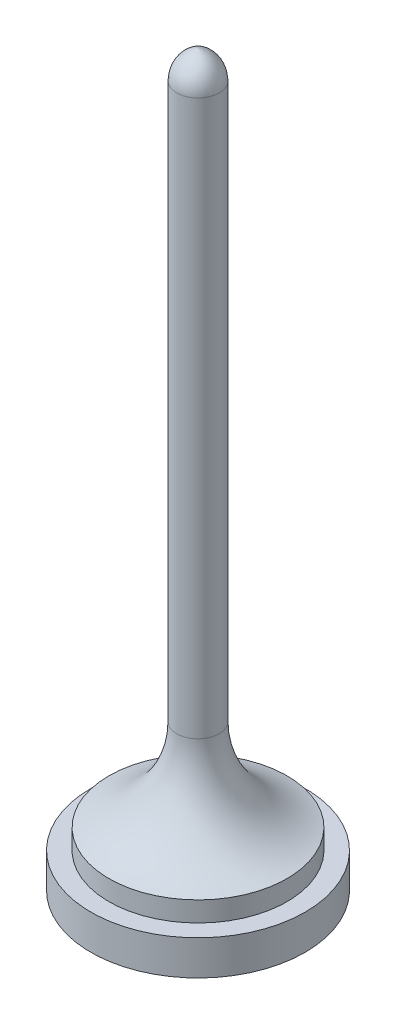
ISO-10303-21;
HEADER;
FILE_DESCRIPTION(('STEP AP214'),'2;1');
FILE_NAME('part.step','',(''),(''),'','','');
FILE_SCHEMA(('AUTOMOTIVE_DESIGN { 1 0 10303 214 1 1 1 1 }'));
ENDSEC;
DATA;
#1=APPLICATION_CONTEXT('core data for automotive mechanical design processes');
#2=APPLICATION_PROTOCOL_DEFINITION('international standard','automotive_design',2000,#1);
#3=PRODUCT_CONTEXT('',#1,'mechanical');
#4=PRODUCT('Part','Part','',(#3));
#5=PRODUCT_RELATED_PRODUCT_CATEGORY('part','',(#4));
#6=PRODUCT_DEFINITION_FORMATION('','',#4);
#7=PRODUCT_DEFINITION_CONTEXT('part definition',#1,'design');
#8=PRODUCT_DEFINITION('design','',#6,#7);
#9=PRODUCT_DEFINITION_SHAPE('','',#8);
#10=(LENGTH_UNIT() NAMED_UNIT(*) SI_UNIT(.MILLI.,.METRE.));
#11=(NAMED_UNIT(*) PLANE_ANGLE_UNIT() SI_UNIT($,.RADIAN.));
#12=(NAMED_UNIT(*) SI_UNIT($,.STERADIAN.) SOLID_ANGLE_UNIT());
#13=UNCERTAINTY_MEASURE_WITH_UNIT(LENGTH_MEASURE(1.E-05),#10,'distance_accuracy_value','');
#14=(GEOMETRIC_REPRESENTATION_CONTEXT(3) GLOBAL_UNCERTAINTY_ASSIGNED_CONTEXT((#13)) GLOBAL_UNIT_ASSIGNED_CONTEXT((#10,
#11,#12)) REPRESENTATION_CONTEXT('',''));
#15=CARTESIAN_POINT('',(0.,0.,0.));
#16=DIRECTION('',(0.,0.,1.));
#17=DIRECTION('',(1.,0.,0.));
#18=AXIS2_PLACEMENT_3D('',#15,#16,#17);
#19=CARTESIAN_POINT('',(1.22433534610712,108.6600566566,0.));
#20=DIRECTION('',(0.,0.,-1.));
#21=DIRECTION('',(-1.,0.,0.));
#22=AXIS2_PLACEMENT_3D('',#19,#20,#21);
#23=CIRCLE('',#22,4.50933534610712);
#24=TRIMMED_CURVE('',#23,(PARAMETER_VALUE(-1.29583339079884)),
(PARAMETER_VALUE(1.29583339079884)),.T.,.PARAMETER.);
#25=CARTESIAN_POINT('',(0.,108.6600566566,0.));
#26=DIRECTION('',(0.,1.,0.));
#27=AXIS1_PLACEMENT('',#25,#26);
#28=SURFACE_OF_REVOLUTION('',#24,#27);
#29=CARTESIAN_POINT('',(0.,108.6600566566,0.));
#30=DIRECTION('',(0.,1.,0.));
#31=DIRECTION('',(-1.,0.,0.));
#32=AXIS2_PLACEMENT_3D('',#29,#30,#31);
#33=CIRCLE('',#32,3.285);
#34=CARTESIAN_POINT('',(-3.285,108.6600566566,0.));
#35=VERTEX_POINT('',#34);
#36=EDGE_CURVE('E11',#35,#35,#33,.T.);
#37=ORIENTED_EDGE('',*,*,#36,.T.);
#38=EDGE_LOOP('',(#37));
#39=FACE_BOUND('',#38,.T.);
#40=CARTESIAN_POINT('',(0.,113.,0.));
#41=VERTEX_POINT('',#40);
#42=VERTEX_LOOP('',#41);
#43=FACE_BOUND('',#42,.T.);
#44=ADVANCED_FACE('F32',(#39,#43),#28,.T.);
#45=CARTESIAN_POINT('',(0.,113.,0.));
#46=DIRECTION('',(0.,1.,0.));
#47=DIRECTION('',(-1.,0.,0.));
#48=AXIS2_PLACEMENT_3D('',#45,#46,#47);
#49=CYLINDRICAL_SURFACE('',#48,3.285);
#50=CARTESIAN_POINT('',(0.,22.6764279519511,0.));
#51=DIRECTION('',(0.,1.,0.));
#52=DIRECTION('',(-1.,0.,0.));
#53=AXIS2_PLACEMENT_3D('',#50,#51,#52);
#54=CIRCLE('',#53,3.285);
#55=CARTESIAN_POINT('',(-3.285,22.6764279519511,0.));
#56=VERTEX_POINT('',#55);
#57=EDGE_CURVE('E38',#56,#56,#54,.T.);
#58=ORIENTED_EDGE('',*,*,#57,.T.);
#59=EDGE_LOOP('',(#58));
#60=FACE_BOUND('',#59,.T.);
#61=ORIENTED_EDGE('',*,*,#36,.F.);
#62=EDGE_LOOP('',(#61));
#63=FACE_BOUND('',#62,.T.);
#64=ADVANCED_FACE('F42',(#60,#63),#49,.T.);
#65=CARTESIAN_POINT('',(0.,22.6764279519511,0.));
#66=DIRECTION('',(0.,1.,0.));
#67=DIRECTION('',(-1.,0.,0.));
#68=AXIS2_PLACEMENT_3D('',#65,#66,#67);
#69=TOROIDAL_SURFACE('',#68,18.0989008310443,14.8139008310443);
#70=CARTESIAN_POINT('',(0.,8.49999999999999,0.));
#71=DIRECTION('',(0.,1.,0.));
#72=DIRECTION('',(-1.,0.,0.));
#73=AXIS2_PLACEMENT_3D('',#70,#71,#72);
#74=CIRCLE('',#73,13.8);
#75=CARTESIAN_POINT('',(-13.8,8.49999999999999,0.));
#76=VERTEX_POINT('',#75);
#77=EDGE_CURVE('E86',#76,#76,#74,.T.);
#78=ORIENTED_EDGE('',*,*,#77,.T.);
#79=EDGE_LOOP('',(#78));
#80=FACE_BOUND('',#79,.T.);
#81=ORIENTED_EDGE('',*,*,#57,.F.);
#82=EDGE_LOOP('',(#81));
#83=FACE_BOUND('',#82,.T.);
#84=ADVANCED_FACE('F47',(#80,#83),#69,.F.);
#85=CARTESIAN_POINT('',(0.,113.,0.));
#86=DIRECTION('',(0.,1.,0.));
#87=DIRECTION('',(-1.,0.,0.));
#88=AXIS2_PLACEMENT_3D('',#85,#86,#87);
#89=CYLINDRICAL_SURFACE('',#88,13.8);
#90=CARTESIAN_POINT('',(0.,5.4,0.));
#91=DIRECTION('',(0.,1.,0.));
#92=DIRECTION('',(-1.,0.,0.));
#93=AXIS2_PLACEMENT_3D('',#90,#91,#92);
#94=CIRCLE('',#93,13.8);
#95=CARTESIAN_POINT('',(-13.8,5.4,0.));
#96=VERTEX_POINT('',#95);
#97=EDGE_CURVE('E81',#96,#96,#94,.T.);
#98=ORIENTED_EDGE('',*,*,#97,.T.);
#99=EDGE_LOOP('',(#98));
#100=FACE_BOUND('',#99,.T.);
#101=ORIENTED_EDGE('',*,*,#77,.F.);
#102=EDGE_LOOP('',(#101));
#103=FACE_BOUND('',#102,.T.);
#104=ADVANCED_FACE('F54',(#100,#103),#89,.T.);
#105=CARTESIAN_POINT('',(-16.6,5.4,0.));
#106=DIRECTION('',(0.,1.,0.));
#107=DIRECTION('',(-1.,0.,0.));
#108=AXIS2_PLACEMENT_3D('',#105,#106,#107);
#109=PLANE('',#108);
#110=CARTESIAN_POINT('',(0.,5.4,0.));
#111=DIRECTION('',(0.,1.,0.));
#112=DIRECTION('',(-1.,0.,0.));
#113=AXIS2_PLACEMENT_3D('',#110,#111,#112);
#114=CIRCLE('',#113,16.6);
#115=CARTESIAN_POINT('',(-16.6,5.4,0.));
#116=VERTEX_POINT('',#115);
#117=EDGE_CURVE('E78',#116,#116,#114,.T.);
#118=ORIENTED_EDGE('',*,*,#117,.T.);
#119=EDGE_LOOP('',(#118));
#120=FACE_BOUND('',#119,.T.);
#121=ORIENTED_EDGE('',*,*,#97,.F.);
#122=EDGE_LOOP('',(#121));
#123=FACE_BOUND('',#122,.T.);
#124=ADVANCED_FACE('F61',(#120,#123),#109,.T.);
#125=CARTESIAN_POINT('',(0.,113.,0.));
#126=DIRECTION('',(0.,1.,0.));
#127=DIRECTION('',(-1.,0.,0.));
#128=AXIS2_PLACEMENT_3D('',#125,#126,#127);
#129=CYLINDRICAL_SURFACE('',#128,16.6);
#130=CARTESIAN_POINT('',(0.,0.,0.));
#131=DIRECTION('',(0.,1.,0.));
#132=DIRECTION('',(-1.,0.,0.));
#133=AXIS2_PLACEMENT_3D('',#130,#131,#132);
#134=CIRCLE('',#133,16.6);
#135=CARTESIAN_POINT('',(-16.6,0.,0.));
#136=VERTEX_POINT('',#135);
#137=EDGE_CURVE('E77',#136,#136,#134,.T.);
#138=ORIENTED_EDGE('',*,*,#137,.T.);
#139=EDGE_LOOP('',(#138));
#140=FACE_BOUND('',#139,.T.);
#141=ORIENTED_EDGE('',*,*,#117,.F.);
#142=EDGE_LOOP('',(#141));
#143=FACE_BOUND('',#142,.T.);
#144=ADVANCED_FACE('F65',(#140,#143),#129,.T.);
#145=CARTESIAN_POINT('',(0.,0.,0.));
#146=DIRECTION('',(0.,-1.,0.));
#147=DIRECTION('',(1.,0.,0.));
#148=AXIS2_PLACEMENT_3D('',#145,#146,#147);
#149=PLANE('',#148);
#150=ORIENTED_EDGE('',*,*,#137,.F.);
#151=EDGE_LOOP('',(#150));
#152=FACE_BOUND('',#151,.T.);
#153=ADVANCED_FACE('F69',(#152),#149,.T.);
#154=CLOSED_SHELL('',(#44,#64,#84,#104,#124,#144,#153));
#155=MANIFOLD_SOLID_BREP('B2',#154);
#156=ADVANCED_BREP_SHAPE_REPRESENTATION('',(#18,#155),#14);
#157=SHAPE_DEFINITION_REPRESENTATION(#9,#156);
ENDSEC;
END-ISO-10303-21;
